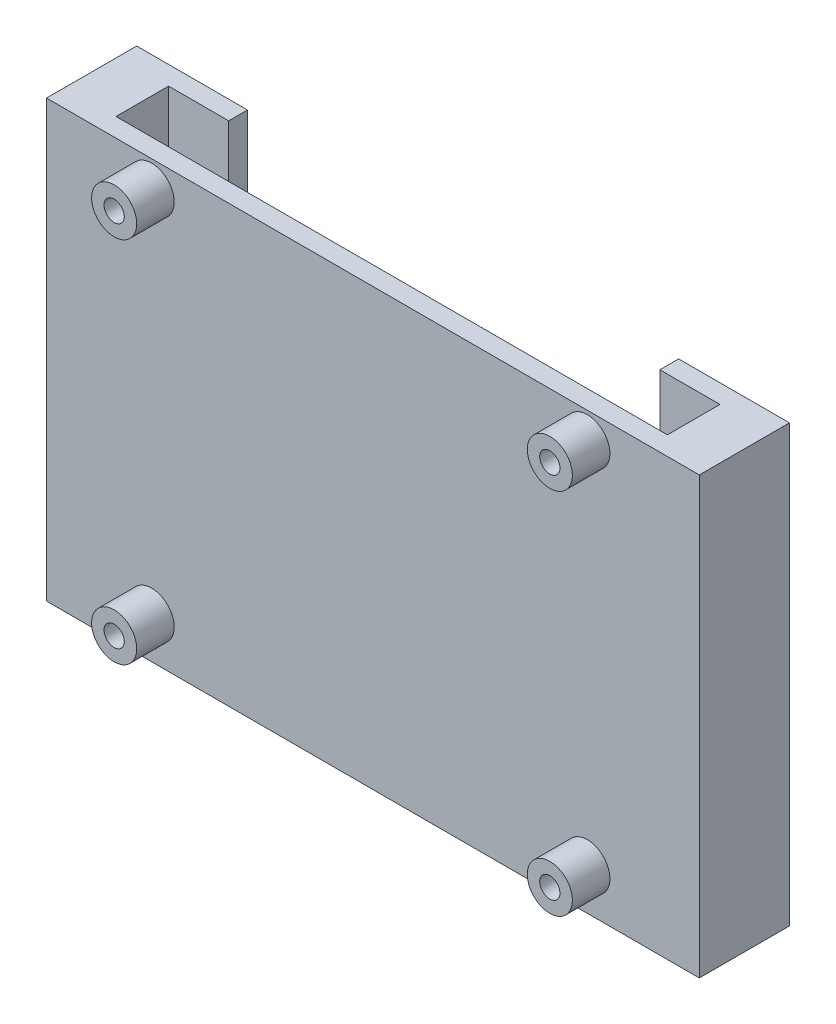
ISO-10303-21;
HEADER;
FILE_DESCRIPTION(('STEP AP214'),'2;1');
FILE_NAME('part.step','',(''),(''),'','','');
FILE_SCHEMA(('AUTOMOTIVE_DESIGN { 1 0 10303 214 1 1 1 1 }'));
ENDSEC;
DATA;
#1=APPLICATION_CONTEXT('core data for automotive mechanical design processes');
#2=APPLICATION_PROTOCOL_DEFINITION('international standard','automotive_design',2000,#1);
#3=PRODUCT_CONTEXT('',#1,'mechanical');
#4=PRODUCT('Part','Part','',(#3));
#5=PRODUCT_RELATED_PRODUCT_CATEGORY('part','',(#4));
#6=PRODUCT_DEFINITION_FORMATION('','',#4);
#7=PRODUCT_DEFINITION_CONTEXT('part definition',#1,'design');
#8=PRODUCT_DEFINITION('design','',#6,#7);
#9=PRODUCT_DEFINITION_SHAPE('','',#8);
#10=(LENGTH_UNIT() NAMED_UNIT(*) SI_UNIT(.MILLI.,.METRE.));
#11=(NAMED_UNIT(*) PLANE_ANGLE_UNIT() SI_UNIT($,.RADIAN.));
#12=(NAMED_UNIT(*) SI_UNIT($,.STERADIAN.) SOLID_ANGLE_UNIT());
#13=UNCERTAINTY_MEASURE_WITH_UNIT(LENGTH_MEASURE(1.E-05),#10,'distance_accuracy_value','');
#14=(GEOMETRIC_REPRESENTATION_CONTEXT(3) GLOBAL_UNCERTAINTY_ASSIGNED_CONTEXT((#13)) GLOBAL_UNIT_ASSIGNED_CONTEXT((#10,
#11,#12)) REPRESENTATION_CONTEXT('',''));
#15=CARTESIAN_POINT('',(0.,0.,0.));
#16=DIRECTION('',(0.,0.,1.));
#17=DIRECTION('',(1.,0.,0.));
#18=AXIS2_PLACEMENT_3D('',#15,#16,#17);
#19=CARTESIAN_POINT('',(-36.7,29.,-9.5));
#20=DIRECTION('',(-1.,0.,0.));
#21=DIRECTION('',(0.,0.,1.));
#22=AXIS2_PLACEMENT_3D('',#19,#20,#21);
#23=PLANE('',#22);
#24=DIRECTION('',(0.,-1.,0.));
#25=VECTOR('',#24,1.);
#26=CARTESIAN_POINT('',(-36.7,29.,-6.99999999999999));
#27=LINE('',#26,#25);
#28=CARTESIAN_POINT('',(-36.7,29.,-6.99999999999999));
#29=VERTEX_POINT('',#28);
#30=CARTESIAN_POINT('',(-36.7,-29.,-6.99999999999999));
#31=VERTEX_POINT('',#30);
#32=EDGE_CURVE('E157',#29,#31,#27,.T.);
#33=ORIENTED_EDGE('',*,*,#32,.F.);
#34=DIRECTION('',(0.,0.,1.));
#35=VECTOR('',#34,1.);
#36=CARTESIAN_POINT('',(-36.7,29.,-9.5));
#37=LINE('',#36,#35);
#38=CARTESIAN_POINT('',(-36.7,29.,0.));
#39=VERTEX_POINT('',#38);
#40=EDGE_CURVE('E187',#29,#39,#37,.T.);
#41=ORIENTED_EDGE('',*,*,#40,.T.);
#42=DIRECTION('',(0.,-1.,0.));
#43=VECTOR('',#42,1.);
#44=CARTESIAN_POINT('',(-36.7,29.,0.));
#45=LINE('',#44,#43);
#46=CARTESIAN_POINT('',(-36.7,-29.,0.));
#47=VERTEX_POINT('',#46);
#48=EDGE_CURVE('E190',#39,#47,#45,.T.);
#49=ORIENTED_EDGE('',*,*,#48,.T.);
#50=DIRECTION('',(0.,0.,1.));
#51=VECTOR('',#50,1.);
#52=CARTESIAN_POINT('',(-36.7,-29.,-9.5));
#53=LINE('',#52,#51);
#54=EDGE_CURVE('E54',#31,#47,#53,.T.);
#55=ORIENTED_EDGE('',*,*,#54,.F.);
#56=EDGE_LOOP('',(#33,#41,#49,#55));
#57=FACE_BOUND('',#56,.T.);
#58=ADVANCED_FACE('F39',(#57),#23,.F.);
#59=CARTESIAN_POINT('',(36.7,29.,-9.5));
#60=DIRECTION('',(1.,0.,0.));
#61=DIRECTION('',(0.,1.,0.));
#62=AXIS2_PLACEMENT_3D('',#59,#60,#61);
#63=PLANE('',#62);
#64=DIRECTION('',(0.,1.,0.));
#65=VECTOR('',#64,1.);
#66=CARTESIAN_POINT('',(36.7,29.,-7.));
#67=LINE('',#66,#65);
#68=CARTESIAN_POINT('',(36.7,-29.,-6.99999999999999));
#69=VERTEX_POINT('',#68);
#70=CARTESIAN_POINT('',(36.7,29.,-7.));
#71=VERTEX_POINT('',#70);
#72=EDGE_CURVE('E170',#69,#71,#67,.T.);
#73=ORIENTED_EDGE('',*,*,#72,.F.);
#74=DIRECTION('',(0.,0.,1.));
#75=VECTOR('',#74,1.);
#76=CARTESIAN_POINT('',(36.7,-29.,-9.5));
#77=LINE('',#76,#75);
#78=CARTESIAN_POINT('',(36.7,-29.,0.));
#79=VERTEX_POINT('',#78);
#80=EDGE_CURVE('E62',#69,#79,#77,.T.);
#81=ORIENTED_EDGE('',*,*,#80,.T.);
#82=DIRECTION('',(0.,1.,0.));
#83=VECTOR('',#82,1.);
#84=CARTESIAN_POINT('',(36.7,29.,0.));
#85=LINE('',#84,#83);
#86=CARTESIAN_POINT('',(36.7,29.,0.));
#87=VERTEX_POINT('',#86);
#88=EDGE_CURVE('E192',#79,#87,#85,.T.);
#89=ORIENTED_EDGE('',*,*,#88,.T.);
#90=DIRECTION('',(0.,0.,1.));
#91=VECTOR('',#90,1.);
#92=CARTESIAN_POINT('',(36.7,29.,-9.5));
#93=LINE('',#92,#91);
#94=EDGE_CURVE('E203',#71,#87,#93,.T.);
#95=ORIENTED_EDGE('',*,*,#94,.F.);
#96=EDGE_LOOP('',(#73,#81,#89,#95));
#97=FACE_BOUND('',#96,.T.);
#98=ADVANCED_FACE('F306',(#97),#63,.F.);
#99=CARTESIAN_POINT('',(0.,0.,0.));
#100=DIRECTION('',(0.,0.,-1.));
#101=DIRECTION('',(-1.,0.,0.));
#102=AXIS2_PLACEMENT_3D('',#99,#100,#101);
#103=PLANE('',#102);
#104=CARTESIAN_POINT('',(-29.45,25.5,0.));
#105=DIRECTION('',(0.,0.,1.));
#106=DIRECTION('',(1.,0.,0.));
#107=AXIS2_PLACEMENT_3D('',#104,#105,#106);
#108=CIRCLE('',#107,1.35);
#109=CARTESIAN_POINT('',(-28.1,25.5,0.));
#110=VERTEX_POINT('',#109);
#111=EDGE_CURVE('E210',#110,#110,#108,.T.);
#112=ORIENTED_EDGE('',*,*,#111,.T.);
#113=EDGE_LOOP('',(#112));
#114=FACE_BOUND('',#113,.T.);
#115=CARTESIAN_POINT('',(-29.45,-23.5,0.));
#116=DIRECTION('',(0.,0.,1.));
#117=DIRECTION('',(1.,0.,0.));
#118=AXIS2_PLACEMENT_3D('',#115,#116,#117);
#119=CIRCLE('',#118,1.35);
#120=CARTESIAN_POINT('',(-28.1,-23.5,0.));
#121=VERTEX_POINT('',#120);
#122=EDGE_CURVE('E216',#121,#121,#119,.T.);
#123=ORIENTED_EDGE('',*,*,#122,.T.);
#124=EDGE_LOOP('',(#123));
#125=FACE_BOUND('',#124,.T.);
#126=CARTESIAN_POINT('',(28.55,25.5,0.));
#127=DIRECTION('',(0.,0.,1.));
#128=DIRECTION('',(1.,0.,0.));
#129=AXIS2_PLACEMENT_3D('',#126,#127,#128);
#130=CIRCLE('',#129,1.35);
#131=CARTESIAN_POINT('',(29.9,25.5,0.));
#132=VERTEX_POINT('',#131);
#133=EDGE_CURVE('E222',#132,#132,#130,.T.);
#134=ORIENTED_EDGE('',*,*,#133,.T.);
#135=EDGE_LOOP('',(#134));
#136=FACE_BOUND('',#135,.T.);
#137=CARTESIAN_POINT('',(28.55,-23.5,0.));
#138=DIRECTION('',(0.,0.,1.));
#139=DIRECTION('',(1.,0.,0.));
#140=AXIS2_PLACEMENT_3D('',#137,#138,#139);
#141=CIRCLE('',#140,1.35);
#142=CARTESIAN_POINT('',(29.9,-23.5,0.));
#143=VERTEX_POINT('',#142);
#144=EDGE_CURVE('E228',#143,#143,#141,.T.);
#145=ORIENTED_EDGE('',*,*,#144,.T.);
#146=EDGE_LOOP('',(#145));
#147=FACE_BOUND('',#146,.T.);
#148=DIRECTION('',(1.,0.,0.));
#149=VECTOR('',#148,1.);
#150=CARTESIAN_POINT('',(-43.45,-29.,0.));
#151=LINE('',#150,#149);
#152=EDGE_CURVE('E248',#47,#79,#151,.T.);
#153=ORIENTED_EDGE('',*,*,#152,.F.);
#154=ORIENTED_EDGE('',*,*,#48,.F.);
#155=DIRECTION('',(-1.,0.,0.));
#156=VECTOR('',#155,1.);
#157=CARTESIAN_POINT('',(-43.45,29.,0.));
#158=LINE('',#157,#156);
#159=EDGE_CURVE('E243',#87,#39,#158,.T.);
#160=ORIENTED_EDGE('',*,*,#159,.F.);
#161=ORIENTED_EDGE('',*,*,#88,.F.);
#162=EDGE_LOOP('',(#153,#154,#160,#161));
#163=FACE_BOUND('',#162,.T.);
#164=ADVANCED_FACE('F310',(#114,#125,#136,#147,#163),#103,.T.);
#165=CARTESIAN_POINT('',(43.45,-29.,2.5));
#166=DIRECTION('',(-1.,0.,0.));
#167=DIRECTION('',(0.,0.,1.));
#168=AXIS2_PLACEMENT_3D('',#165,#166,#167);
#169=PLANE('',#168);
#170=DIRECTION('',(0.,0.,-1.));
#171=VECTOR('',#170,1.);
#172=CARTESIAN_POINT('',(43.45,-29.,2.5));
#173=LINE('',#172,#171);
#174=CARTESIAN_POINT('',(43.45,-29.,2.5));
#175=VERTEX_POINT('',#174);
#176=CARTESIAN_POINT('',(43.45,-29.,-9.5));
#177=VERTEX_POINT('',#176);
#178=EDGE_CURVE('E254',#175,#177,#173,.T.);
#179=ORIENTED_EDGE('',*,*,#178,.T.);
#180=DIRECTION('',(0.,-1.,0.));
#181=VECTOR('',#180,1.);
#182=CARTESIAN_POINT('',(43.45,29.,-9.5));
#183=LINE('',#182,#181);
#184=CARTESIAN_POINT('',(43.45,29.,-9.5));
#185=VERTEX_POINT('',#184);
#186=EDGE_CURVE('E195',#185,#177,#183,.T.);
#187=ORIENTED_EDGE('',*,*,#186,.F.);
#188=DIRECTION('',(0.,0.,-1.));
#189=VECTOR('',#188,1.);
#190=CARTESIAN_POINT('',(43.45,29.,2.5));
#191=LINE('',#190,#189);
#192=CARTESIAN_POINT('',(43.45,29.,2.5));
#193=VERTEX_POINT('',#192);
#194=EDGE_CURVE('E263',#193,#185,#191,.T.);
#195=ORIENTED_EDGE('',*,*,#194,.F.);
#196=DIRECTION('',(0.,1.,0.));
#197=VECTOR('',#196,1.);
#198=CARTESIAN_POINT('',(43.45,-29.,2.5));
#199=LINE('',#198,#197);
#200=EDGE_CURVE('E244',#175,#193,#199,.T.);
#201=ORIENTED_EDGE('',*,*,#200,.F.);
#202=EDGE_LOOP('',(#179,#187,#195,#201));
#203=FACE_BOUND('',#202,.T.);
#204=ADVANCED_FACE('F41',(#203),#169,.F.);
#205=CARTESIAN_POINT('',(-43.45,29.,2.5));
#206=DIRECTION('',(0.,-1.,0.));
#207=DIRECTION('',(0.,0.,-1.));
#208=AXIS2_PLACEMENT_3D('',#205,#206,#207);
#209=PLANE('',#208);
#210=ORIENTED_EDGE('',*,*,#194,.T.);
#211=DIRECTION('',(1.,0.,0.));
#212=VECTOR('',#211,1.);
#213=CARTESIAN_POINT('',(43.45,29.,-9.5));
#214=LINE('',#213,#212);
#215=CARTESIAN_POINT('',(28.7,29.,-9.5));
#216=VERTEX_POINT('',#215);
#217=EDGE_CURVE('E200',#216,#185,#214,.T.);
#218=ORIENTED_EDGE('',*,*,#217,.F.);
#219=DIRECTION('',(0.,0.,-1.));
#220=VECTOR('',#219,1.);
#221=CARTESIAN_POINT('',(28.7,29.,-9.5));
#222=LINE('',#221,#220);
#223=CARTESIAN_POINT('',(28.7,29.,-7.));
#224=VERTEX_POINT('',#223);
#225=EDGE_CURVE('E178',#224,#216,#222,.T.);
#226=ORIENTED_EDGE('',*,*,#225,.F.);
#227=DIRECTION('',(1.,0.,0.));
#228=VECTOR('',#227,1.);
#229=CARTESIAN_POINT('',(28.7,29.,-7.));
#230=LINE('',#229,#228);
#231=EDGE_CURVE('E181',#224,#71,#230,.T.);
#232=ORIENTED_EDGE('',*,*,#231,.T.);
#233=ORIENTED_EDGE('',*,*,#94,.T.);
#234=ORIENTED_EDGE('',*,*,#159,.T.);
#235=ORIENTED_EDGE('',*,*,#40,.F.);
#236=DIRECTION('',(-1.,0.,0.));
#237=VECTOR('',#236,1.);
#238=CARTESIAN_POINT('',(-28.7,29.,-6.99999999999999));
#239=LINE('',#238,#237);
#240=CARTESIAN_POINT('',(-28.7,29.,-6.99999999999999));
#241=VERTEX_POINT('',#240);
#242=EDGE_CURVE('E148',#241,#29,#239,.T.);
#243=ORIENTED_EDGE('',*,*,#242,.F.);
#244=DIRECTION('',(0.,0.,1.));
#245=VECTOR('',#244,1.);
#246=CARTESIAN_POINT('',(-28.7,29.,-9.5));
#247=LINE('',#246,#245);
#248=CARTESIAN_POINT('',(-28.7,29.,-9.5));
#249=VERTEX_POINT('',#248);
#250=EDGE_CURVE('E145',#249,#241,#247,.T.);
#251=ORIENTED_EDGE('',*,*,#250,.F.);
#252=DIRECTION('',(1.,0.,0.));
#253=VECTOR('',#252,1.);
#254=CARTESIAN_POINT('',(-43.45,29.,-9.5));
#255=LINE('',#254,#253);
#256=CARTESIAN_POINT('',(-43.45,29.,-9.5));
#257=VERTEX_POINT('',#256);
#258=EDGE_CURVE('E132',#257,#249,#255,.T.);
#259=ORIENTED_EDGE('',*,*,#258,.F.);
#260=DIRECTION('',(0.,0.,-1.));
#261=VECTOR('',#260,1.);
#262=CARTESIAN_POINT('',(-43.45,29.,2.5));
#263=LINE('',#262,#261);
#264=CARTESIAN_POINT('',(-43.45,29.,2.5));
#265=VERTEX_POINT('',#264);
#266=EDGE_CURVE('E261',#265,#257,#263,.T.);
#267=ORIENTED_EDGE('',*,*,#266,.F.);
#268=DIRECTION('',(-1.,0.,0.));
#269=VECTOR('',#268,1.);
#270=CARTESIAN_POINT('',(-43.45,29.,2.5));
#271=LINE('',#270,#269);
#272=EDGE_CURVE('E247',#193,#265,#271,.T.);
#273=ORIENTED_EDGE('',*,*,#272,.F.);
#274=EDGE_LOOP('',(#210,#218,#226,#232,#233,#234,#235,#243,#251,#259,#267,#273));
#275=FACE_BOUND('',#274,.T.);
#276=ADVANCED_FACE('F146',(#275),#209,.F.);
#277=CARTESIAN_POINT('',(-43.45,-29.,2.5));
#278=DIRECTION('',(1.,0.,0.));
#279=DIRECTION('',(0.,0.,-1.));
#280=AXIS2_PLACEMENT_3D('',#277,#278,#279);
#281=PLANE('',#280);
#282=ORIENTED_EDGE('',*,*,#266,.T.);
#283=DIRECTION('',(0.,1.,0.));
#284=VECTOR('',#283,1.);
#285=CARTESIAN_POINT('',(-43.45,29.,-9.5));
#286=LINE('',#285,#284);
#287=CARTESIAN_POINT('',(-43.45,-29.,-9.5));
#288=VERTEX_POINT('',#287);
#289=EDGE_CURVE('E139',#288,#257,#286,.T.);
#290=ORIENTED_EDGE('',*,*,#289,.F.);
#291=DIRECTION('',(0.,0.,-1.));
#292=VECTOR('',#291,1.);
#293=CARTESIAN_POINT('',(-43.45,-29.,2.5));
#294=LINE('',#293,#292);
#295=CARTESIAN_POINT('',(-43.45,-29.,2.5));
#296=VERTEX_POINT('',#295);
#297=EDGE_CURVE('E259',#296,#288,#294,.T.);
#298=ORIENTED_EDGE('',*,*,#297,.F.);
#299=DIRECTION('',(0.,-1.,0.));
#300=VECTOR('',#299,1.);
#301=CARTESIAN_POINT('',(-43.45,-29.,2.5));
#302=LINE('',#301,#300);
#303=EDGE_CURVE('E250',#265,#296,#302,.T.);
#304=ORIENTED_EDGE('',*,*,#303,.F.);
#305=EDGE_LOOP('',(#282,#290,#298,#304));
#306=FACE_BOUND('',#305,.T.);
#307=ADVANCED_FACE('F319',(#306),#281,.F.);
#308=CARTESIAN_POINT('',(-43.45,-29.,2.5));
#309=DIRECTION('',(0.,1.,0.));
#310=DIRECTION('',(0.,0.,1.));
#311=AXIS2_PLACEMENT_3D('',#308,#309,#310);
#312=PLANE('',#311);
#313=CARTESIAN_POINT('',(-40.075,-29.,-3.5));
#314=DIRECTION('',(0.,-1.,0.));
#315=DIRECTION('',(0.,0.,-1.));
#316=AXIS2_PLACEMENT_3D('',#313,#314,#315);
#317=CIRCLE('',#316,3.15);
#318=CARTESIAN_POINT('',(-40.075,-29.,-6.65));
#319=VERTEX_POINT('',#318);
#320=EDGE_CURVE('E517',#319,#319,#317,.T.);
#321=ORIENTED_EDGE('',*,*,#320,.F.);
#322=EDGE_LOOP('',(#321));
#323=FACE_BOUND('',#322,.T.);
#324=CARTESIAN_POINT('',(40.075,-29.,-3.5));
#325=DIRECTION('',(0.,-1.,0.));
#326=DIRECTION('',(0.,0.,-1.));
#327=AXIS2_PLACEMENT_3D('',#324,#325,#326);
#328=CIRCLE('',#327,3.15);
#329=CARTESIAN_POINT('',(40.075,-29.,-6.65));
#330=VERTEX_POINT('',#329);
#331=EDGE_CURVE('E520',#330,#330,#328,.T.);
#332=ORIENTED_EDGE('',*,*,#331,.F.);
#333=EDGE_LOOP('',(#332));
#334=FACE_BOUND('',#333,.T.);
#335=ORIENTED_EDGE('',*,*,#297,.T.);
#336=DIRECTION('',(-1.,0.,0.));
#337=VECTOR('',#336,1.);
#338=CARTESIAN_POINT('',(-43.45,-29.,-9.5));
#339=LINE('',#338,#337);
#340=CARTESIAN_POINT('',(-28.7,-29.,-9.50000000000001));
#341=VERTEX_POINT('',#340);
#342=EDGE_CURVE('E142',#341,#288,#339,.T.);
#343=ORIENTED_EDGE('',*,*,#342,.F.);
#344=DIRECTION('',(0.,0.,-1.));
#345=VECTOR('',#344,1.);
#346=CARTESIAN_POINT('',(-28.7,-29.,-9.50000000000001));
#347=LINE('',#346,#345);
#348=CARTESIAN_POINT('',(-28.7,-29.,-6.99999999999999));
#349=VERTEX_POINT('',#348);
#350=EDGE_CURVE('E156',#349,#341,#347,.T.);
#351=ORIENTED_EDGE('',*,*,#350,.F.);
#352=DIRECTION('',(-1.,0.,0.));
#353=VECTOR('',#352,1.);
#354=CARTESIAN_POINT('',(-28.7,-29.,-6.99999999999999));
#355=LINE('',#354,#353);
#356=EDGE_CURVE('E166',#349,#31,#355,.T.);
#357=ORIENTED_EDGE('',*,*,#356,.T.);
#358=ORIENTED_EDGE('',*,*,#54,.T.);
#359=ORIENTED_EDGE('',*,*,#152,.T.);
#360=ORIENTED_EDGE('',*,*,#80,.F.);
#361=DIRECTION('',(1.,0.,0.));
#362=VECTOR('',#361,1.);
#363=CARTESIAN_POINT('',(28.7,-29.,-6.99999999999999));
#364=LINE('',#363,#362);
#365=CARTESIAN_POINT('',(28.7,-29.,-6.99999999999999));
#366=VERTEX_POINT('',#365);
#367=EDGE_CURVE('E185',#366,#69,#364,.T.);
#368=ORIENTED_EDGE('',*,*,#367,.F.);
#369=DIRECTION('',(0.,0.,1.));
#370=VECTOR('',#369,1.);
#371=CARTESIAN_POINT('',(28.7,-29.,-9.49999999999999));
#372=LINE('',#371,#370);
#373=CARTESIAN_POINT('',(28.7,-29.,-9.49999999999999));
#374=VERTEX_POINT('',#373);
#375=EDGE_CURVE('E174',#374,#366,#372,.T.);
#376=ORIENTED_EDGE('',*,*,#375,.F.);
#377=DIRECTION('',(-1.,0.,0.));
#378=VECTOR('',#377,1.);
#379=CARTESIAN_POINT('',(43.45,-29.,-9.5));
#380=LINE('',#379,#378);
#381=EDGE_CURVE('E198',#177,#374,#380,.T.);
#382=ORIENTED_EDGE('',*,*,#381,.F.);
#383=ORIENTED_EDGE('',*,*,#178,.F.);
#384=DIRECTION('',(1.,0.,0.));
#385=VECTOR('',#384,1.);
#386=CARTESIAN_POINT('',(-43.45,-29.,2.5));
#387=LINE('',#386,#385);
#388=EDGE_CURVE('E252',#296,#175,#387,.T.);
#389=ORIENTED_EDGE('',*,*,#388,.F.);
#390=EDGE_LOOP('',(#335,#343,#351,#357,#358,#359,#360,#368,#376,#382,#383,#389));
#391=FACE_BOUND('',#390,.T.);
#392=ADVANCED_FACE('F279',(#323,#334,#391),#312,.F.);
#393=CARTESIAN_POINT('',(0.,0.,2.5));
#394=DIRECTION('',(0.,0.,-1.));
#395=DIRECTION('',(-1.,0.,0.));
#396=AXIS2_PLACEMENT_3D('',#393,#394,#395);
#397=PLANE('',#396);
#398=CARTESIAN_POINT('',(28.55,-23.5,2.5));
#399=DIRECTION('',(0.,0.,-1.));
#400=DIRECTION('',(-1.,0.,0.));
#401=AXIS2_PLACEMENT_3D('',#398,#399,#400);
#402=CIRCLE('',#401,3.);
#403=CARTESIAN_POINT('',(25.55,-23.5,2.5));
#404=VERTEX_POINT('',#403);
#405=EDGE_CURVE('E11',#404,#404,#402,.F.);
#406=ORIENTED_EDGE('',*,*,#405,.F.);
#407=EDGE_LOOP('',(#406));
#408=FACE_BOUND('',#407,.T.);
#409=CARTESIAN_POINT('',(-29.45,-23.5,2.5));
#410=DIRECTION('',(0.,0.,-1.));
#411=DIRECTION('',(-1.,0.,0.));
#412=AXIS2_PLACEMENT_3D('',#409,#410,#411);
#413=CIRCLE('',#412,3.);
#414=CARTESIAN_POINT('',(-32.45,-23.5,2.5));
#415=VERTEX_POINT('',#414);
#416=EDGE_CURVE('E47',#415,#415,#413,.F.);
#417=ORIENTED_EDGE('',*,*,#416,.F.);
#418=EDGE_LOOP('',(#417));
#419=FACE_BOUND('',#418,.T.);
#420=CARTESIAN_POINT('',(28.55,25.5,2.5));
#421=DIRECTION('',(0.,0.,-1.));
#422=DIRECTION('',(-1.,0.,0.));
#423=AXIS2_PLACEMENT_3D('',#420,#421,#422);
#424=CIRCLE('',#423,3.);
#425=CARTESIAN_POINT('',(25.55,25.5,2.5));
#426=VERTEX_POINT('',#425);
#427=EDGE_CURVE('E268',#426,#426,#424,.F.);
#428=ORIENTED_EDGE('',*,*,#427,.F.);
#429=EDGE_LOOP('',(#428));
#430=FACE_BOUND('',#429,.T.);
#431=CARTESIAN_POINT('',(-29.45,25.5,2.5));
#432=DIRECTION('',(0.,0.,-1.));
#433=DIRECTION('',(-1.,0.,0.));
#434=AXIS2_PLACEMENT_3D('',#431,#432,#433);
#435=CIRCLE('',#434,3.);
#436=CARTESIAN_POINT('',(-32.45,25.5,2.5));
#437=VERTEX_POINT('',#436);
#438=EDGE_CURVE('E265',#437,#437,#435,.F.);
#439=ORIENTED_EDGE('',*,*,#438,.F.);
#440=EDGE_LOOP('',(#439));
#441=FACE_BOUND('',#440,.T.);
#442=ORIENTED_EDGE('',*,*,#200,.T.);
#443=ORIENTED_EDGE('',*,*,#272,.T.);
#444=ORIENTED_EDGE('',*,*,#303,.T.);
#445=ORIENTED_EDGE('',*,*,#388,.T.);
#446=EDGE_LOOP('',(#442,#443,#444,#445));
#447=FACE_BOUND('',#446,.T.);
#448=ADVANCED_FACE('F275',(#408,#419,#430,#441,#447),#397,.F.);
#449=CARTESIAN_POINT('',(-29.45,25.5,7.5));
#450=DIRECTION('',(0.,0.,-1.));
#451=DIRECTION('',(-1.,0.,0.));
#452=AXIS2_PLACEMENT_3D('',#449,#450,#451);
#453=CYLINDRICAL_SURFACE('',#452,3.);
#454=CARTESIAN_POINT('',(-29.45,25.5,7.5));
#455=DIRECTION('',(0.,0.,1.));
#456=DIRECTION('',(1.,0.,0.));
#457=AXIS2_PLACEMENT_3D('',#454,#455,#456);
#458=CIRCLE('',#457,3.);
#459=CARTESIAN_POINT('',(-26.45,25.5,7.5));
#460=VERTEX_POINT('',#459);
#461=EDGE_CURVE('E240',#460,#460,#458,.T.);
#462=ORIENTED_EDGE('',*,*,#461,.F.);
#463=EDGE_LOOP('',(#462));
#464=FACE_BOUND('',#463,.T.);
#465=ORIENTED_EDGE('',*,*,#438,.T.);
#466=EDGE_LOOP('',(#465));
#467=FACE_BOUND('',#466,.T.);
#468=ADVANCED_FACE('F278',(#464,#467),#453,.T.);
#469=CARTESIAN_POINT('',(-29.45,25.5,7.5));
#470=DIRECTION('',(0.,0.,1.));
#471=DIRECTION('',(1.,0.,0.));
#472=AXIS2_PLACEMENT_3D('',#469,#470,#471);
#473=PLANE('',#472);
#474=CARTESIAN_POINT('',(-29.45,25.5,7.5));
#475=DIRECTION('',(0.,0.,1.));
#476=DIRECTION('',(1.,0.,0.));
#477=AXIS2_PLACEMENT_3D('',#474,#475,#476);
#478=CIRCLE('',#477,1.34999999999999);
#479=CARTESIAN_POINT('',(-28.1,25.5,7.5));
#480=VERTEX_POINT('',#479);
#481=EDGE_CURVE('E207',#480,#480,#478,.T.);
#482=ORIENTED_EDGE('',*,*,#481,.F.);
#483=EDGE_LOOP('',(#482));
#484=FACE_BOUND('',#483,.T.);
#485=ORIENTED_EDGE('',*,*,#461,.T.);
#486=EDGE_LOOP('',(#485));
#487=FACE_BOUND('',#486,.T.);
#488=ADVANCED_FACE('F375',(#484,#487),#473,.T.);
#489=CARTESIAN_POINT('',(28.55,25.5,7.5));
#490=DIRECTION('',(0.,0.,-1.));
#491=DIRECTION('',(-1.,0.,0.));
#492=AXIS2_PLACEMENT_3D('',#489,#490,#491);
#493=CYLINDRICAL_SURFACE('',#492,3.);
#494=CARTESIAN_POINT('',(28.55,25.5,7.5));
#495=DIRECTION('',(0.,0.,1.));
#496=DIRECTION('',(1.,0.,0.));
#497=AXIS2_PLACEMENT_3D('',#494,#495,#496);
#498=CIRCLE('',#497,3.);
#499=CARTESIAN_POINT('',(31.55,25.5,7.5));
#500=VERTEX_POINT('',#499);
#501=EDGE_CURVE('E237',#500,#500,#498,.T.);
#502=ORIENTED_EDGE('',*,*,#501,.F.);
#503=EDGE_LOOP('',(#502));
#504=FACE_BOUND('',#503,.T.);
#505=ORIENTED_EDGE('',*,*,#427,.T.);
#506=EDGE_LOOP('',(#505));
#507=FACE_BOUND('',#506,.T.);
#508=ADVANCED_FACE('F372',(#504,#507),#493,.T.);
#509=CARTESIAN_POINT('',(28.55,25.5,7.5));
#510=DIRECTION('',(0.,0.,1.));
#511=DIRECTION('',(1.,0.,0.));
#512=AXIS2_PLACEMENT_3D('',#509,#510,#511);
#513=PLANE('',#512);
#514=CARTESIAN_POINT('',(28.55,25.5,7.5));
#515=DIRECTION('',(0.,0.,1.));
#516=DIRECTION('',(1.,0.,0.));
#517=AXIS2_PLACEMENT_3D('',#514,#515,#516);
#518=CIRCLE('',#517,1.34999999999999);
#519=CARTESIAN_POINT('',(29.9,25.5,7.5));
#520=VERTEX_POINT('',#519);
#521=EDGE_CURVE('E219',#520,#520,#518,.T.);
#522=ORIENTED_EDGE('',*,*,#521,.F.);
#523=EDGE_LOOP('',(#522));
#524=FACE_BOUND('',#523,.T.);
#525=ORIENTED_EDGE('',*,*,#501,.T.);
#526=EDGE_LOOP('',(#525));
#527=FACE_BOUND('',#526,.T.);
#528=ADVANCED_FACE('F370',(#524,#527),#513,.T.);
#529=CARTESIAN_POINT('',(-29.45,-23.5,7.5));
#530=DIRECTION('',(0.,0.,-1.));
#531=DIRECTION('',(-1.,0.,0.));
#532=AXIS2_PLACEMENT_3D('',#529,#530,#531);
#533=CYLINDRICAL_SURFACE('',#532,3.);
#534=CARTESIAN_POINT('',(-29.45,-23.5,7.5));
#535=DIRECTION('',(0.,0.,1.));
#536=DIRECTION('',(1.,0.,0.));
#537=AXIS2_PLACEMENT_3D('',#534,#535,#536);
#538=CIRCLE('',#537,3.);
#539=CARTESIAN_POINT('',(-26.45,-23.5,7.5));
#540=VERTEX_POINT('',#539);
#541=EDGE_CURVE('E234',#540,#540,#538,.T.);
#542=ORIENTED_EDGE('',*,*,#541,.F.);
#543=EDGE_LOOP('',(#542));
#544=FACE_BOUND('',#543,.T.);
#545=ORIENTED_EDGE('',*,*,#416,.T.);
#546=EDGE_LOOP('',(#545));
#547=FACE_BOUND('',#546,.T.);
#548=ADVANCED_FACE('F273',(#544,#547),#533,.T.);
#549=CARTESIAN_POINT('',(-29.45,-23.5,7.5));
#550=DIRECTION('',(0.,0.,1.));
#551=DIRECTION('',(1.,0.,0.));
#552=AXIS2_PLACEMENT_3D('',#549,#550,#551);
#553=PLANE('',#552);
#554=CARTESIAN_POINT('',(-29.45,-23.5,7.5));
#555=DIRECTION('',(0.,0.,1.));
#556=DIRECTION('',(1.,0.,0.));
#557=AXIS2_PLACEMENT_3D('',#554,#555,#556);
#558=CIRCLE('',#557,1.34999999999999);
#559=CARTESIAN_POINT('',(-28.1,-23.5,7.5));
#560=VERTEX_POINT('',#559);
#561=EDGE_CURVE('E213',#560,#560,#558,.T.);
#562=ORIENTED_EDGE('',*,*,#561,.F.);
#563=EDGE_LOOP('',(#562));
#564=FACE_BOUND('',#563,.T.);
#565=ORIENTED_EDGE('',*,*,#541,.T.);
#566=EDGE_LOOP('',(#565));
#567=FACE_BOUND('',#566,.T.);
#568=ADVANCED_FACE('F363',(#564,#567),#553,.T.);
#569=CARTESIAN_POINT('',(28.55,-23.5,7.5));
#570=DIRECTION('',(0.,0.,-1.));
#571=DIRECTION('',(-1.,0.,0.));
#572=AXIS2_PLACEMENT_3D('',#569,#570,#571);
#573=CYLINDRICAL_SURFACE('',#572,3.);
#574=CARTESIAN_POINT('',(28.55,-23.5,7.5));
#575=DIRECTION('',(0.,0.,1.));
#576=DIRECTION('',(1.,0.,0.));
#577=AXIS2_PLACEMENT_3D('',#574,#575,#576);
#578=CIRCLE('',#577,3.);
#579=CARTESIAN_POINT('',(31.55,-23.5,7.5));
#580=VERTEX_POINT('',#579);
#581=EDGE_CURVE('E231',#580,#580,#578,.T.);
#582=ORIENTED_EDGE('',*,*,#581,.F.);
#583=EDGE_LOOP('',(#582));
#584=FACE_BOUND('',#583,.T.);
#585=ORIENTED_EDGE('',*,*,#405,.T.);
#586=EDGE_LOOP('',(#585));
#587=FACE_BOUND('',#586,.T.);
#588=ADVANCED_FACE('F359',(#584,#587),#573,.T.);
#589=CARTESIAN_POINT('',(28.55,-23.5,7.5));
#590=DIRECTION('',(0.,0.,1.));
#591=DIRECTION('',(1.,0.,0.));
#592=AXIS2_PLACEMENT_3D('',#589,#590,#591);
#593=PLANE('',#592);
#594=CARTESIAN_POINT('',(28.55,-23.5,7.5));
#595=DIRECTION('',(0.,0.,1.));
#596=DIRECTION('',(1.,0.,0.));
#597=AXIS2_PLACEMENT_3D('',#594,#595,#596);
#598=CIRCLE('',#597,1.34999999999999);
#599=CARTESIAN_POINT('',(29.9,-23.5,7.5));
#600=VERTEX_POINT('',#599);
#601=EDGE_CURVE('E225',#600,#600,#598,.T.);
#602=ORIENTED_EDGE('',*,*,#601,.F.);
#603=EDGE_LOOP('',(#602));
#604=FACE_BOUND('',#603,.T.);
#605=ORIENTED_EDGE('',*,*,#581,.T.);
#606=EDGE_LOOP('',(#605));
#607=FACE_BOUND('',#606,.T.);
#608=ADVANCED_FACE('F355',(#604,#607),#593,.T.);
#609=CARTESIAN_POINT('',(28.55,-23.5,7.5));
#610=DIRECTION('',(0.,0.,1.));
#611=DIRECTION('',(1.,0.,0.));
#612=AXIS2_PLACEMENT_3D('',#609,#610,#611);
#613=CYLINDRICAL_SURFACE('',#612,1.35);
#614=ORIENTED_EDGE('',*,*,#144,.F.);
#615=EDGE_LOOP('',(#614));
#616=FACE_BOUND('',#615,.T.);
#617=ORIENTED_EDGE('',*,*,#601,.T.);
#618=EDGE_LOOP('',(#617));
#619=FACE_BOUND('',#618,.T.);
#620=ADVANCED_FACE('F351',(#616,#619),#613,.F.);
#621=CARTESIAN_POINT('',(28.55,25.5,7.5));
#622=DIRECTION('',(0.,0.,1.));
#623=DIRECTION('',(1.,0.,0.));
#624=AXIS2_PLACEMENT_3D('',#621,#622,#623);
#625=CYLINDRICAL_SURFACE('',#624,1.35);
#626=ORIENTED_EDGE('',*,*,#133,.F.);
#627=EDGE_LOOP('',(#626));
#628=FACE_BOUND('',#627,.T.);
#629=ORIENTED_EDGE('',*,*,#521,.T.);
#630=EDGE_LOOP('',(#629));
#631=FACE_BOUND('',#630,.T.);
#632=ADVANCED_FACE('F347',(#628,#631),#625,.F.);
#633=CARTESIAN_POINT('',(-29.45,-23.5,7.5));
#634=DIRECTION('',(0.,0.,1.));
#635=DIRECTION('',(1.,0.,0.));
#636=AXIS2_PLACEMENT_3D('',#633,#634,#635);
#637=CYLINDRICAL_SURFACE('',#636,1.35);
#638=ORIENTED_EDGE('',*,*,#122,.F.);
#639=EDGE_LOOP('',(#638));
#640=FACE_BOUND('',#639,.T.);
#641=ORIENTED_EDGE('',*,*,#561,.T.);
#642=EDGE_LOOP('',(#641));
#643=FACE_BOUND('',#642,.T.);
#644=ADVANCED_FACE('F343',(#640,#643),#637,.F.);
#645=CARTESIAN_POINT('',(-29.45,25.5,7.5));
#646=DIRECTION('',(0.,0.,1.));
#647=DIRECTION('',(1.,0.,0.));
#648=AXIS2_PLACEMENT_3D('',#645,#646,#647);
#649=CYLINDRICAL_SURFACE('',#648,1.35);
#650=ORIENTED_EDGE('',*,*,#111,.F.);
#651=EDGE_LOOP('',(#650));
#652=FACE_BOUND('',#651,.T.);
#653=ORIENTED_EDGE('',*,*,#481,.T.);
#654=EDGE_LOOP('',(#653));
#655=FACE_BOUND('',#654,.T.);
#656=ADVANCED_FACE('F339',(#652,#655),#649,.F.);
#657=CARTESIAN_POINT('',(0.,0.,-9.5));
#658=DIRECTION('',(0.,0.,-1.));
#659=DIRECTION('',(-1.,0.,0.));
#660=AXIS2_PLACEMENT_3D('',#657,#658,#659);
#661=PLANE('',#660);
#662=ORIENTED_EDGE('',*,*,#186,.T.);
#663=ORIENTED_EDGE('',*,*,#381,.T.);
#664=DIRECTION('',(0.,-1.,0.));
#665=VECTOR('',#664,1.);
#666=CARTESIAN_POINT('',(28.7,29.,-9.5));
#667=LINE('',#666,#665);
#668=EDGE_CURVE('E171',#216,#374,#667,.T.);
#669=ORIENTED_EDGE('',*,*,#668,.F.);
#670=ORIENTED_EDGE('',*,*,#217,.T.);
#671=EDGE_LOOP('',(#662,#663,#669,#670));
#672=FACE_BOUND('',#671,.T.);
#673=ADVANCED_FACE('F295',(#672),#661,.T.);
#674=CARTESIAN_POINT('',(0.,0.,-9.5));
#675=DIRECTION('',(0.,0.,1.));
#676=DIRECTION('',(1.,0.,0.));
#677=AXIS2_PLACEMENT_3D('',#674,#675,#676);
#678=PLANE('',#677);
#679=ORIENTED_EDGE('',*,*,#289,.T.);
#680=ORIENTED_EDGE('',*,*,#258,.T.);
#681=DIRECTION('',(0.,1.,0.));
#682=VECTOR('',#681,1.);
#683=CARTESIAN_POINT('',(-28.7,29.,-9.5));
#684=LINE('',#683,#682);
#685=EDGE_CURVE('E137',#341,#249,#684,.T.);
#686=ORIENTED_EDGE('',*,*,#685,.F.);
#687=ORIENTED_EDGE('',*,*,#342,.T.);
#688=EDGE_LOOP('',(#679,#680,#686,#687));
#689=FACE_BOUND('',#688,.T.);
#690=ADVANCED_FACE('F134',(#689),#678,.F.);
#691=CARTESIAN_POINT('',(28.7,29.,-7.));
#692=DIRECTION('',(0.,0.,-1.));
#693=DIRECTION('',(0.,1.,0.));
#694=AXIS2_PLACEMENT_3D('',#691,#692,#693);
#695=PLANE('',#694);
#696=ORIENTED_EDGE('',*,*,#72,.T.);
#697=ORIENTED_EDGE('',*,*,#231,.F.);
#698=DIRECTION('',(0.,1.,0.));
#699=VECTOR('',#698,1.);
#700=CARTESIAN_POINT('',(28.7,29.,-7.));
#701=LINE('',#700,#699);
#702=EDGE_CURVE('E176',#366,#224,#701,.T.);
#703=ORIENTED_EDGE('',*,*,#702,.F.);
#704=ORIENTED_EDGE('',*,*,#367,.T.);
#705=EDGE_LOOP('',(#696,#697,#703,#704));
#706=FACE_BOUND('',#705,.T.);
#707=ADVANCED_FACE('F321',(#706),#695,.F.);
#708=CARTESIAN_POINT('',(28.7,0.,0.));
#709=DIRECTION('',(-1.,0.,0.));
#710=DIRECTION('',(0.,-1.,0.));
#711=AXIS2_PLACEMENT_3D('',#708,#709,#710);
#712=PLANE('',#711);
#713=ORIENTED_EDGE('',*,*,#668,.T.);
#714=ORIENTED_EDGE('',*,*,#375,.T.);
#715=ORIENTED_EDGE('',*,*,#702,.T.);
#716=ORIENTED_EDGE('',*,*,#225,.T.);
#717=EDGE_LOOP('',(#713,#714,#715,#716));
#718=FACE_BOUND('',#717,.T.);
#719=ADVANCED_FACE('F299',(#718),#712,.T.);
#720=CARTESIAN_POINT('',(-28.7,29.,-6.99999999999999));
#721=DIRECTION('',(0.,0.,-1.));
#722=DIRECTION('',(0.,1.,0.));
#723=AXIS2_PLACEMENT_3D('',#720,#721,#722);
#724=PLANE('',#723);
#725=ORIENTED_EDGE('',*,*,#32,.T.);
#726=ORIENTED_EDGE('',*,*,#356,.F.);
#727=DIRECTION('',(0.,-1.,0.));
#728=VECTOR('',#727,1.);
#729=CARTESIAN_POINT('',(-28.7,29.,-6.99999999999999));
#730=LINE('',#729,#728);
#731=EDGE_CURVE('E151',#241,#349,#730,.T.);
#732=ORIENTED_EDGE('',*,*,#731,.F.);
#733=ORIENTED_EDGE('',*,*,#242,.T.);
#734=EDGE_LOOP('',(#725,#726,#732,#733));
#735=FACE_BOUND('',#734,.T.);
#736=ADVANCED_FACE('F316',(#735),#724,.F.);
#737=CARTESIAN_POINT('',(-28.7,0.,0.));
#738=DIRECTION('',(-1.,0.,0.));
#739=DIRECTION('',(0.,-1.,0.));
#740=AXIS2_PLACEMENT_3D('',#737,#738,#739);
#741=PLANE('',#740);
#742=ORIENTED_EDGE('',*,*,#685,.T.);
#743=ORIENTED_EDGE('',*,*,#250,.T.);
#744=ORIENTED_EDGE('',*,*,#731,.T.);
#745=ORIENTED_EDGE('',*,*,#350,.T.);
#746=EDGE_LOOP('',(#742,#743,#744,#745));
#747=FACE_BOUND('',#746,.T.);
#748=ADVANCED_FACE('F154',(#747),#741,.F.);
#749=CARTESIAN_POINT('',(40.075,-26.3,-3.5));
#750=DIRECTION('',(0.,-1.,0.));
#751=DIRECTION('',(0.,0.,-1.));
#752=AXIS2_PLACEMENT_3D('',#749,#750,#751);
#753=CYLINDRICAL_SURFACE('',#752,3.15);
#754=CARTESIAN_POINT('',(40.075,-26.3,-3.5));
#755=DIRECTION('',(0.,-1.,0.));
#756=DIRECTION('',(0.,0.,-1.));
#757=AXIS2_PLACEMENT_3D('',#754,#755,#756);
#758=CIRCLE('',#757,3.15);
#759=CARTESIAN_POINT('',(40.075,-26.3,-6.65));
#760=VERTEX_POINT('',#759);
#761=EDGE_CURVE('E162',#760,#760,#758,.T.);
#762=CARTESIAN_POINT('',(40.075,-26.3,-6.65));
#763=CARTESIAN_POINT('',(40.075,-26.328125,-6.65));
#764=CARTESIAN_POINT('',(40.075,-26.35625,-6.65));
#765=CARTESIAN_POINT('',(40.075,-26.4125,-6.65));
#766=CARTESIAN_POINT('',(40.075,-26.440625,-6.65));
#767=CARTESIAN_POINT('',(40.075,-26.496875,-6.65));
#768=CARTESIAN_POINT('',(40.075,-26.525,-6.65));
#769=CARTESIAN_POINT('',(40.075,-26.58125,-6.65));
#770=CARTESIAN_POINT('',(40.075,-26.609375,-6.65));
#771=CARTESIAN_POINT('',(40.075,-26.665625,-6.65));
#772=CARTESIAN_POINT('',(40.075,-26.69375,-6.65));
#773=CARTESIAN_POINT('',(40.075,-26.75,-6.65));
#774=CARTESIAN_POINT('',(40.075,-26.778125,-6.65));
#775=CARTESIAN_POINT('',(40.075,-26.834375,-6.65));
#776=CARTESIAN_POINT('',(40.075,-26.8625,-6.65));
#777=CARTESIAN_POINT('',(40.075,-26.91875,-6.65));
#778=CARTESIAN_POINT('',(40.075,-26.946875,-6.65));
#779=CARTESIAN_POINT('',(40.075,-27.003125,-6.65));
#780=CARTESIAN_POINT('',(40.075,-27.03125,-6.65));
#781=CARTESIAN_POINT('',(40.075,-27.0875,-6.65));
#782=CARTESIAN_POINT('',(40.075,-27.115625,-6.65));
#783=CARTESIAN_POINT('',(40.075,-27.171875,-6.65));
#784=CARTESIAN_POINT('',(40.075,-27.2,-6.65));
#785=CARTESIAN_POINT('',(40.075,-27.25625,-6.65));
#786=CARTESIAN_POINT('',(40.075,-27.284375,-6.65));
#787=CARTESIAN_POINT('',(40.075,-27.340625,-6.65));
#788=CARTESIAN_POINT('',(40.075,-27.36875,-6.65));
#789=CARTESIAN_POINT('',(40.075,-27.425,-6.65));
#790=CARTESIAN_POINT('',(40.075,-27.453125,-6.65));
#791=CARTESIAN_POINT('',(40.075,-27.509375,-6.65));
#792=CARTESIAN_POINT('',(40.075,-27.5375,-6.65));
#793=CARTESIAN_POINT('',(40.075,-27.59375,-6.65));
#794=CARTESIAN_POINT('',(40.075,-27.621875,-6.65));
#795=CARTESIAN_POINT('',(40.075,-27.678125,-6.65));
#796=CARTESIAN_POINT('',(40.075,-27.70625,-6.65));
#797=CARTESIAN_POINT('',(40.075,-27.7625,-6.65));
#798=CARTESIAN_POINT('',(40.075,-27.790625,-6.65));
#799=CARTESIAN_POINT('',(40.075,-27.846875,-6.65));
#800=CARTESIAN_POINT('',(40.075,-27.875,-6.65));
#801=CARTESIAN_POINT('',(40.075,-27.93125,-6.65));
#802=CARTESIAN_POINT('',(40.075,-27.959375,-6.65));
#803=CARTESIAN_POINT('',(40.075,-28.015625,-6.65));
#804=CARTESIAN_POINT('',(40.075,-28.04375,-6.65));
#805=CARTESIAN_POINT('',(40.075,-28.1,-6.65));
#806=CARTESIAN_POINT('',(40.075,-28.128125,-6.65));
#807=CARTESIAN_POINT('',(40.075,-28.184375,-6.65));
#808=CARTESIAN_POINT('',(40.075,-28.2125,-6.65));
#809=CARTESIAN_POINT('',(40.075,-28.26875,-6.65));
#810=CARTESIAN_POINT('',(40.075,-28.296875,-6.65));
#811=CARTESIAN_POINT('',(40.075,-28.353125,-6.65));
#812=CARTESIAN_POINT('',(40.075,-28.38125,-6.65));
#813=CARTESIAN_POINT('',(40.075,-28.4375,-6.65));
#814=CARTESIAN_POINT('',(40.075,-28.465625,-6.65));
#815=CARTESIAN_POINT('',(40.075,-28.521875,-6.65));
#816=CARTESIAN_POINT('',(40.075,-28.55,-6.65));
#817=CARTESIAN_POINT('',(40.075,-28.60625,-6.65));
#818=CARTESIAN_POINT('',(40.075,-28.634375,-6.65));
#819=CARTESIAN_POINT('',(40.075,-28.690625,-6.65));
#820=CARTESIAN_POINT('',(40.075,-28.71875,-6.65));
#821=CARTESIAN_POINT('',(40.075,-28.775,-6.65));
#822=CARTESIAN_POINT('',(40.075,-28.803125,-6.65));
#823=CARTESIAN_POINT('',(40.075,-28.859375,-6.65));
#824=CARTESIAN_POINT('',(40.075,-28.8875,-6.65));
#825=CARTESIAN_POINT('',(40.075,-28.94375,-6.65));
#826=CARTESIAN_POINT('',(40.075,-28.971875,-6.65));
#827=CARTESIAN_POINT('',(40.075,-29.,-6.65));
#828=B_SPLINE_CURVE_WITH_KNOTS('',3,(#762,#763,#764,#765,#766,#767,#768,#769,#770,#771,#772,
#773,#774,#775,#776,#777,#778,#779,#780,#781,#782,#783,#784,#785,#786,#787,#788,#789,#790,#791,
#792,#793,#794,#795,#796,#797,#798,#799,#800,#801,#802,#803,#804,#805,#806,#807,#808,#809,#810,
#811,#812,#813,#814,#815,#816,#817,#818,#819,#820,#821,#822,#823,#824,#825,#826,#827),
.UNSPECIFIED.,.F.,.F.,(4,2,2,2,2,2,2,2,2,2,2,2,2,2,2,2,2,2,2,2,2,2,2,2,2,2,2,2,2,2,2,2,4),(0.,
0.0843749999999976,0.168749999999999,0.253125,0.337499999999998,0.421874999999999,0.50625,
0.590624999999997,0.674999999999998,0.759375,0.843749999999997,0.928124999999998,1.0125,
1.096875,1.18125,1.265625,1.35,1.434375,1.51875,1.603125,1.6875,1.771875,1.85625,1.940625,2.025,
2.109375,2.19375,2.278125,2.3625,2.446875,2.53125,2.615625,2.7),.UNSPECIFIED.);
#829=EDGE_CURVE('BSEAM474',#760,#330,#828,.T.);
#830=ORIENTED_EDGE('',*,*,#761,.F.);
#831=ORIENTED_EDGE('',*,*,#331,.T.);
#832=ORIENTED_EDGE('',*,*,#829,.T.);
#833=ORIENTED_EDGE('',*,*,#829,.F.);
#834=EDGE_LOOP('',(#830,#832,#831,#833));
#835=FACE_BOUND('',#834,.T.);
#836=ADVANCED_FACE('F474',(#835),#753,.F.);
#837=CARTESIAN_POINT('',(40.075,-26.3,-3.5));
#838=DIRECTION('',(0.,-1.,0.));
#839=DIRECTION('',(0.,0.,-1.));
#840=AXIS2_PLACEMENT_3D('',#837,#838,#839);
#841=PLANE('',#840);
#842=ORIENTED_EDGE('',*,*,#761,.T.);
#843=EDGE_LOOP('',(#842));
#844=FACE_BOUND('',#843,.T.);
#845=ADVANCED_FACE('F482',(#844),#841,.T.);
#846=CARTESIAN_POINT('',(-40.075,-26.3,-3.5));
#847=DIRECTION('',(0.,-1.,0.));
#848=DIRECTION('',(0.,0.,-1.));
#849=AXIS2_PLACEMENT_3D('',#846,#847,#848);
#850=CYLINDRICAL_SURFACE('',#849,3.15);
#851=CARTESIAN_POINT('',(-40.075,-26.3,-3.5));
#852=DIRECTION('',(0.,-1.,0.));
#853=DIRECTION('',(0.,0.,-1.));
#854=AXIS2_PLACEMENT_3D('',#851,#852,#853);
#855=CIRCLE('',#854,3.15);
#856=CARTESIAN_POINT('',(-40.075,-26.3,-6.65));
#857=VERTEX_POINT('',#856);
#858=EDGE_CURVE('E159',#857,#857,#855,.T.);
#859=CARTESIAN_POINT('',(-40.075,-26.3,-6.65));
#860=CARTESIAN_POINT('',(-40.075,-26.328125,-6.65));
#861=CARTESIAN_POINT('',(-40.075,-26.35625,-6.65));
#862=CARTESIAN_POINT('',(-40.075,-26.4125,-6.65));
#863=CARTESIAN_POINT('',(-40.075,-26.440625,-6.65));
#864=CARTESIAN_POINT('',(-40.075,-26.496875,-6.65));
#865=CARTESIAN_POINT('',(-40.075,-26.525,-6.65));
#866=CARTESIAN_POINT('',(-40.075,-26.58125,-6.65));
#867=CARTESIAN_POINT('',(-40.075,-26.609375,-6.65));
#868=CARTESIAN_POINT('',(-40.075,-26.665625,-6.65));
#869=CARTESIAN_POINT('',(-40.075,-26.69375,-6.65));
#870=CARTESIAN_POINT('',(-40.075,-26.75,-6.65));
#871=CARTESIAN_POINT('',(-40.075,-26.778125,-6.65));
#872=CARTESIAN_POINT('',(-40.075,-26.834375,-6.65));
#873=CARTESIAN_POINT('',(-40.075,-26.8625,-6.65));
#874=CARTESIAN_POINT('',(-40.075,-26.91875,-6.65));
#875=CARTESIAN_POINT('',(-40.075,-26.946875,-6.65));
#876=CARTESIAN_POINT('',(-40.075,-27.003125,-6.65));
#877=CARTESIAN_POINT('',(-40.075,-27.03125,-6.65));
#878=CARTESIAN_POINT('',(-40.075,-27.0875,-6.65));
#879=CARTESIAN_POINT('',(-40.075,-27.115625,-6.65));
#880=CARTESIAN_POINT('',(-40.075,-27.171875,-6.65));
#881=CARTESIAN_POINT('',(-40.075,-27.2,-6.65));
#882=CARTESIAN_POINT('',(-40.075,-27.25625,-6.65));
#883=CARTESIAN_POINT('',(-40.075,-27.284375,-6.65));
#884=CARTESIAN_POINT('',(-40.075,-27.340625,-6.65));
#885=CARTESIAN_POINT('',(-40.075,-27.36875,-6.65));
#886=CARTESIAN_POINT('',(-40.075,-27.425,-6.65));
#887=CARTESIAN_POINT('',(-40.075,-27.453125,-6.65));
#888=CARTESIAN_POINT('',(-40.075,-27.509375,-6.65));
#889=CARTESIAN_POINT('',(-40.075,-27.5375,-6.65));
#890=CARTESIAN_POINT('',(-40.075,-27.59375,-6.65));
#891=CARTESIAN_POINT('',(-40.075,-27.621875,-6.65));
#892=CARTESIAN_POINT('',(-40.075,-27.678125,-6.65));
#893=CARTESIAN_POINT('',(-40.075,-27.70625,-6.65));
#894=CARTESIAN_POINT('',(-40.075,-27.7625,-6.65));
#895=CARTESIAN_POINT('',(-40.075,-27.790625,-6.65));
#896=CARTESIAN_POINT('',(-40.075,-27.846875,-6.65));
#897=CARTESIAN_POINT('',(-40.075,-27.875,-6.65));
#898=CARTESIAN_POINT('',(-40.075,-27.93125,-6.65));
#899=CARTESIAN_POINT('',(-40.075,-27.959375,-6.65));
#900=CARTESIAN_POINT('',(-40.075,-28.015625,-6.65));
#901=CARTESIAN_POINT('',(-40.075,-28.04375,-6.65));
#902=CARTESIAN_POINT('',(-40.075,-28.1,-6.65));
#903=CARTESIAN_POINT('',(-40.075,-28.128125,-6.65));
#904=CARTESIAN_POINT('',(-40.075,-28.184375,-6.65));
#905=CARTESIAN_POINT('',(-40.075,-28.2125,-6.65));
#906=CARTESIAN_POINT('',(-40.075,-28.26875,-6.65));
#907=CARTESIAN_POINT('',(-40.075,-28.296875,-6.65));
#908=CARTESIAN_POINT('',(-40.075,-28.353125,-6.65));
#909=CARTESIAN_POINT('',(-40.075,-28.38125,-6.65));
#910=CARTESIAN_POINT('',(-40.075,-28.4375,-6.65));
#911=CARTESIAN_POINT('',(-40.075,-28.465625,-6.65));
#912=CARTESIAN_POINT('',(-40.075,-28.521875,-6.65));
#913=CARTESIAN_POINT('',(-40.075,-28.55,-6.65));
#914=CARTESIAN_POINT('',(-40.075,-28.60625,-6.65));
#915=CARTESIAN_POINT('',(-40.075,-28.634375,-6.65));
#916=CARTESIAN_POINT('',(-40.075,-28.690625,-6.65));
#917=CARTESIAN_POINT('',(-40.075,-28.71875,-6.65));
#918=CARTESIAN_POINT('',(-40.075,-28.775,-6.65));
#919=CARTESIAN_POINT('',(-40.075,-28.803125,-6.65));
#920=CARTESIAN_POINT('',(-40.075,-28.859375,-6.65));
#921=CARTESIAN_POINT('',(-40.075,-28.8875,-6.65));
#922=CARTESIAN_POINT('',(-40.075,-28.94375,-6.65));
#923=CARTESIAN_POINT('',(-40.075,-28.971875,-6.65));
#924=CARTESIAN_POINT('',(-40.075,-29.,-6.65));
#925=B_SPLINE_CURVE_WITH_KNOTS('',3,(#859,#860,#861,#862,#863,#864,#865,#866,#867,#868,#869,
#870,#871,#872,#873,#874,#875,#876,#877,#878,#879,#880,#881,#882,#883,#884,#885,#886,#887,#888,
#889,#890,#891,#892,#893,#894,#895,#896,#897,#898,#899,#900,#901,#902,#903,#904,#905,#906,#907,
#908,#909,#910,#911,#912,#913,#914,#915,#916,#917,#918,#919,#920,#921,#922,#923,#924),
.UNSPECIFIED.,.F.,.F.,(4,2,2,2,2,2,2,2,2,2,2,2,2,2,2,2,2,2,2,2,2,2,2,2,2,2,2,2,2,2,2,2,4),(0.,
0.0843749999999976,0.168749999999999,0.253125,0.337499999999998,0.421874999999999,0.50625,
0.590624999999997,0.674999999999998,0.759375,0.843749999999997,0.928124999999998,1.0125,
1.096875,1.18125,1.265625,1.35,1.434375,1.51875,1.603125,1.6875,1.771875,1.85625,1.940625,2.025,
2.109375,2.19375,2.278125,2.3625,2.446875,2.53125,2.615625,2.7),.UNSPECIFIED.);
#926=EDGE_CURVE('BSEAM492',#857,#319,#925,.T.);
#927=ORIENTED_EDGE('',*,*,#858,.F.);
#928=ORIENTED_EDGE('',*,*,#320,.T.);
#929=ORIENTED_EDGE('',*,*,#926,.T.);
#930=ORIENTED_EDGE('',*,*,#926,.F.);
#931=EDGE_LOOP('',(#927,#929,#928,#930));
#932=FACE_BOUND('',#931,.T.);
#933=ADVANCED_FACE('F492',(#932),#850,.F.);
#934=CARTESIAN_POINT('',(-40.075,-26.3,-3.5));
#935=DIRECTION('',(0.,-1.,0.));
#936=DIRECTION('',(0.,0.,-1.));
#937=AXIS2_PLACEMENT_3D('',#934,#935,#936);
#938=PLANE('',#937);
#939=ORIENTED_EDGE('',*,*,#858,.T.);
#940=EDGE_LOOP('',(#939));
#941=FACE_BOUND('',#940,.T.);
#942=ADVANCED_FACE('F502',(#941),#938,.T.);
#943=CLOSED_SHELL('',(#58,#98,#164,#204,#276,#307,#392,#448,#468,#488,#508,#528,#548,#568,#588,
#608,#620,#632,#644,#656,#673,#690,#707,#719,#736,#748,#836,#845,#933,#942));
#944=MANIFOLD_SOLID_BREP('B2',#943);
#945=ADVANCED_BREP_SHAPE_REPRESENTATION('',(#18,#944),#14);
#946=SHAPE_DEFINITION_REPRESENTATION(#9,#945);
ENDSEC;
END-ISO-10303-21;
